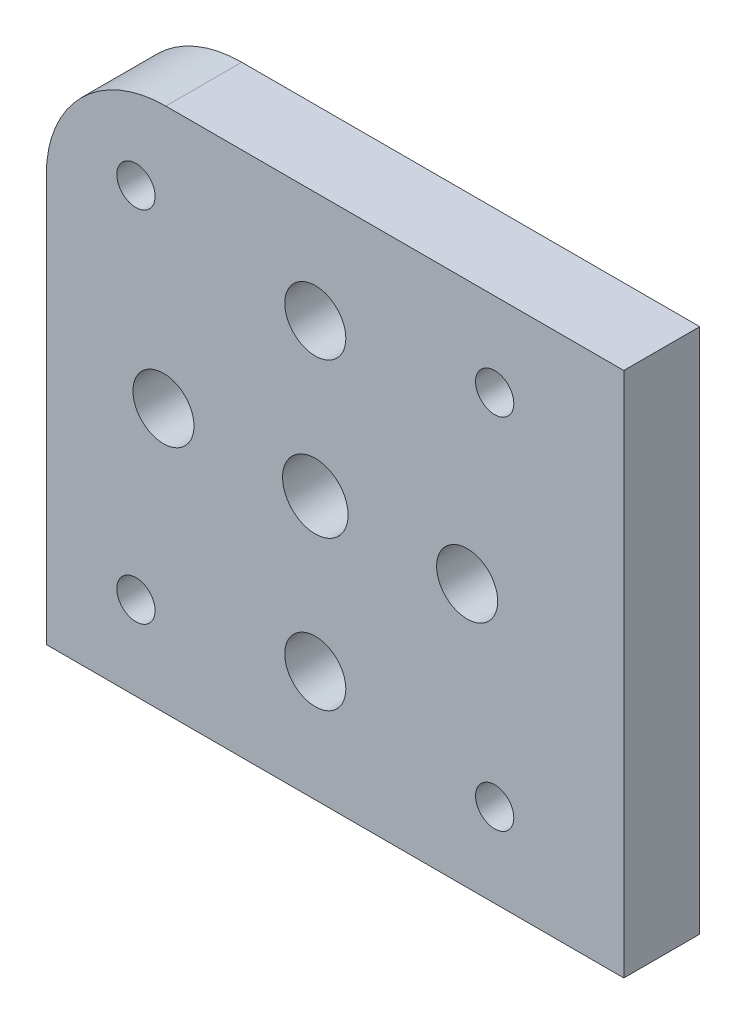
ISO-10303-21;
HEADER;
FILE_DESCRIPTION(('STEP AP214'),'2;1');
FILE_NAME('part.step','',(''),(''),'','','');
FILE_SCHEMA(('AUTOMOTIVE_DESIGN { 1 0 10303 214 1 1 1 1 }'));
ENDSEC;
DATA;
#1=APPLICATION_CONTEXT('core data for automotive mechanical design processes');
#2=APPLICATION_PROTOCOL_DEFINITION('international standard','automotive_design',2000,#1);
#3=PRODUCT_CONTEXT('',#1,'mechanical');
#4=PRODUCT('Part','Part','',(#3));
#5=PRODUCT_RELATED_PRODUCT_CATEGORY('part','',(#4));
#6=PRODUCT_DEFINITION_FORMATION('','',#4);
#7=PRODUCT_DEFINITION_CONTEXT('part definition',#1,'design');
#8=PRODUCT_DEFINITION('design','',#6,#7);
#9=PRODUCT_DEFINITION_SHAPE('','',#8);
#10=(LENGTH_UNIT() NAMED_UNIT(*) SI_UNIT(.MILLI.,.METRE.));
#11=(NAMED_UNIT(*) PLANE_ANGLE_UNIT() SI_UNIT($,.RADIAN.));
#12=(NAMED_UNIT(*) SI_UNIT($,.STERADIAN.) SOLID_ANGLE_UNIT());
#13=UNCERTAINTY_MEASURE_WITH_UNIT(LENGTH_MEASURE(1.E-05),#10,'distance_accuracy_value','');
#14=(GEOMETRIC_REPRESENTATION_CONTEXT(3) GLOBAL_UNCERTAINTY_ASSIGNED_CONTEXT((#13)) GLOBAL_UNIT_ASSIGNED_CONTEXT((#10,
#11,#12)) REPRESENTATION_CONTEXT('',''));
#15=CARTESIAN_POINT('',(0.,0.,0.));
#16=DIRECTION('',(0.,0.,1.));
#17=DIRECTION('',(1.,0.,0.));
#18=AXIS2_PLACEMENT_3D('',#15,#16,#17);
#19=CARTESIAN_POINT('',(48.3,0.,6.35));
#20=DIRECTION('',(1.,0.,0.));
#21=DIRECTION('',(0.,1.,0.));
#22=AXIS2_PLACEMENT_3D('',#19,#20,#21);
#23=PLANE('',#22);
#24=DIRECTION('',(0.,-1.,0.));
#25=VECTOR('',#24,1.);
#26=CARTESIAN_POINT('',(48.3,0.,0.));
#27=LINE('',#26,#25);
#28=CARTESIAN_POINT('',(48.3,0.,0.));
#29=VERTEX_POINT('',#28);
#30=CARTESIAN_POINT('',(48.3,-44.,0.));
#31=VERTEX_POINT('',#30);
#32=EDGE_CURVE('E103',#29,#31,#27,.T.);
#33=ORIENTED_EDGE('',*,*,#32,.F.);
#34=DIRECTION('',(0.,0.,-1.));
#35=VECTOR('',#34,1.);
#36=CARTESIAN_POINT('',(48.3,0.,6.35));
#37=LINE('',#36,#35);
#38=CARTESIAN_POINT('',(48.3,0.,6.35));
#39=VERTEX_POINT('',#38);
#40=EDGE_CURVE('E92',#39,#29,#37,.T.);
#41=ORIENTED_EDGE('',*,*,#40,.F.);
#42=DIRECTION('',(0.,-1.,0.));
#43=VECTOR('',#42,1.);
#44=CARTESIAN_POINT('',(48.3,0.,6.35));
#45=LINE('',#44,#43);
#46=CARTESIAN_POINT('',(48.3,-44.,6.35));
#47=VERTEX_POINT('',#46);
#48=EDGE_CURVE('E98',#39,#47,#45,.T.);
#49=ORIENTED_EDGE('',*,*,#48,.T.);
#50=DIRECTION('',(0.,0.,-1.));
#51=VECTOR('',#50,1.);
#52=CARTESIAN_POINT('',(48.3,-44.,6.35));
#53=LINE('',#52,#51);
#54=EDGE_CURVE('E120',#47,#31,#53,.T.);
#55=ORIENTED_EDGE('',*,*,#54,.T.);
#56=EDGE_LOOP('',(#33,#41,#49,#55));
#57=FACE_BOUND('',#56,.T.);
#58=ADVANCED_FACE('F46',(#57),#23,.T.);
#59=CARTESIAN_POINT('',(0.,0.,6.35));
#60=DIRECTION('',(0.,1.,0.));
#61=DIRECTION('',(0.,0.,1.));
#62=AXIS2_PLACEMENT_3D('',#59,#60,#61);
#63=PLANE('',#62);
#64=DIRECTION('',(1.,0.,0.));
#65=VECTOR('',#64,1.);
#66=CARTESIAN_POINT('',(0.,0.,0.));
#67=LINE('',#66,#65);
#68=CARTESIAN_POINT('',(10.,0.,0.));
#69=VERTEX_POINT('',#68);
#70=EDGE_CURVE('E149',#69,#29,#67,.T.);
#71=ORIENTED_EDGE('',*,*,#70,.F.);
#72=DIRECTION('',(0.,0.,-1.));
#73=VECTOR('',#72,1.);
#74=CARTESIAN_POINT('',(10.,0.,6.35));
#75=LINE('',#74,#73);
#76=CARTESIAN_POINT('',(10.,0.,6.35));
#77=VERTEX_POINT('',#76);
#78=EDGE_CURVE('E54',#69,#77,#75,.F.);
#79=ORIENTED_EDGE('',*,*,#78,.T.);
#80=DIRECTION('',(1.,0.,0.));
#81=VECTOR('',#80,1.);
#82=CARTESIAN_POINT('',(0.,0.,6.35));
#83=LINE('',#82,#81);
#84=EDGE_CURVE('E89',#77,#39,#83,.T.);
#85=ORIENTED_EDGE('',*,*,#84,.T.);
#86=ORIENTED_EDGE('',*,*,#40,.T.);
#87=EDGE_LOOP('',(#71,#79,#85,#86));
#88=FACE_BOUND('',#87,.T.);
#89=ADVANCED_FACE('F91',(#88),#63,.T.);
#90=CARTESIAN_POINT('',(0.,0.,6.35));
#91=DIRECTION('',(1.,0.,0.));
#92=DIRECTION('',(0.,1.,0.));
#93=AXIS2_PLACEMENT_3D('',#90,#91,#92);
#94=PLANE('',#93);
#95=DIRECTION('',(0.,-1.,0.));
#96=VECTOR('',#95,1.);
#97=CARTESIAN_POINT('',(0.,0.,6.35));
#98=LINE('',#97,#96);
#99=CARTESIAN_POINT('',(0.,-10.,6.35));
#100=VERTEX_POINT('',#99);
#101=CARTESIAN_POINT('',(0.,-44.,6.35));
#102=VERTEX_POINT('',#101);
#103=EDGE_CURVE('E97',#100,#102,#98,.T.);
#104=ORIENTED_EDGE('',*,*,#103,.F.);
#105=DIRECTION('',(0.,0.,-1.));
#106=VECTOR('',#105,1.);
#107=CARTESIAN_POINT('',(0.,-10.,0.));
#108=LINE('',#107,#106);
#109=CARTESIAN_POINT('',(0.,-10.,0.));
#110=VERTEX_POINT('',#109);
#111=EDGE_CURVE('E104',#100,#110,#108,.T.);
#112=ORIENTED_EDGE('',*,*,#111,.T.);
#113=DIRECTION('',(0.,-1.,0.));
#114=VECTOR('',#113,1.);
#115=CARTESIAN_POINT('',(0.,0.,0.));
#116=LINE('',#115,#114);
#117=CARTESIAN_POINT('',(0.,-44.,0.));
#118=VERTEX_POINT('',#117);
#119=EDGE_CURVE('E151',#110,#118,#116,.T.);
#120=ORIENTED_EDGE('',*,*,#119,.T.);
#121=DIRECTION('',(0.,0.,-1.));
#122=VECTOR('',#121,1.);
#123=CARTESIAN_POINT('',(0.,-44.,6.35));
#124=LINE('',#123,#122);
#125=EDGE_CURVE('E105',#102,#118,#124,.T.);
#126=ORIENTED_EDGE('',*,*,#125,.F.);
#127=EDGE_LOOP('',(#104,#112,#120,#126));
#128=FACE_BOUND('',#127,.T.);
#129=ADVANCED_FACE('F165',(#128),#94,.F.);
#130=CARTESIAN_POINT('',(7.5,-37.,6.35));
#131=DIRECTION('',(0.,0.,-1.));
#132=DIRECTION('',(-1.,0.,0.));
#133=AXIS2_PLACEMENT_3D('',#130,#131,#132);
#134=CYLINDRICAL_SURFACE('',#133,1.6);
#135=CARTESIAN_POINT('',(7.5,-37.,6.35));
#136=DIRECTION('',(0.,0.,1.));
#137=DIRECTION('',(1.,0.,0.));
#138=AXIS2_PLACEMENT_3D('',#135,#136,#137);
#139=CIRCLE('',#138,1.6);
#140=CARTESIAN_POINT('',(9.1,-37.,6.35));
#141=VERTEX_POINT('',#140);
#142=EDGE_CURVE('E111',#141,#141,#139,.T.);
#143=ORIENTED_EDGE('',*,*,#142,.T.);
#144=EDGE_LOOP('',(#143));
#145=FACE_BOUND('',#144,.T.);
#146=CARTESIAN_POINT('',(7.5,-37.,0.));
#147=DIRECTION('',(0.,0.,1.));
#148=DIRECTION('',(1.,0.,0.));
#149=AXIS2_PLACEMENT_3D('',#146,#147,#148);
#150=CIRCLE('',#149,1.6);
#151=CARTESIAN_POINT('',(9.1,-37.,0.));
#152=VERTEX_POINT('',#151);
#153=EDGE_CURVE('E145',#152,#152,#150,.T.);
#154=ORIENTED_EDGE('',*,*,#153,.F.);
#155=EDGE_LOOP('',(#154));
#156=FACE_BOUND('',#155,.T.);
#157=ADVANCED_FACE('F192',(#145,#156),#134,.F.);
#158=CARTESIAN_POINT('',(22.5,-9.3,6.35));
#159=DIRECTION('',(0.,0.,-1.));
#160=DIRECTION('',(-1.,0.,0.));
#161=AXIS2_PLACEMENT_3D('',#158,#159,#160);
#162=CYLINDRICAL_SURFACE('',#161,2.5527);
#163=CARTESIAN_POINT('',(22.5,-9.3,6.35));
#164=DIRECTION('',(0.,0.,1.));
#165=DIRECTION('',(1.,0.,0.));
#166=AXIS2_PLACEMENT_3D('',#163,#164,#165);
#167=CIRCLE('',#166,2.5527);
#168=CARTESIAN_POINT('',(25.0527,-9.3,6.35));
#169=VERTEX_POINT('',#168);
#170=EDGE_CURVE('E114',#169,#169,#167,.T.);
#171=ORIENTED_EDGE('',*,*,#170,.T.);
#172=EDGE_LOOP('',(#171));
#173=FACE_BOUND('',#172,.T.);
#174=CARTESIAN_POINT('',(22.5,-9.3,0.));
#175=DIRECTION('',(0.,0.,1.));
#176=DIRECTION('',(1.,0.,0.));
#177=AXIS2_PLACEMENT_3D('',#174,#175,#176);
#178=CIRCLE('',#177,2.5527);
#179=CARTESIAN_POINT('',(25.0527,-9.3,0.));
#180=VERTEX_POINT('',#179);
#181=EDGE_CURVE('E142',#180,#180,#178,.T.);
#182=ORIENTED_EDGE('',*,*,#181,.F.);
#183=EDGE_LOOP('',(#182));
#184=FACE_BOUND('',#183,.T.);
#185=ADVANCED_FACE('F195',(#173,#184),#162,.F.);
#186=CARTESIAN_POINT('',(35.2,-22.,6.35));
#187=DIRECTION('',(0.,0.,-1.));
#188=DIRECTION('',(-1.,0.,0.));
#189=AXIS2_PLACEMENT_3D('',#186,#187,#188);
#190=CYLINDRICAL_SURFACE('',#189,2.5527);
#191=CARTESIAN_POINT('',(35.2,-22.,6.35));
#192=DIRECTION('',(0.,0.,1.));
#193=DIRECTION('',(1.,0.,0.));
#194=AXIS2_PLACEMENT_3D('',#191,#192,#193);
#195=CIRCLE('',#194,2.5527);
#196=CARTESIAN_POINT('',(37.7527,-22.,6.35));
#197=VERTEX_POINT('',#196);
#198=EDGE_CURVE('E428',#197,#197,#195,.T.);
#199=ORIENTED_EDGE('',*,*,#198,.T.);
#200=EDGE_LOOP('',(#199));
#201=FACE_BOUND('',#200,.T.);
#202=CARTESIAN_POINT('',(35.2,-22.,0.));
#203=DIRECTION('',(0.,0.,1.));
#204=DIRECTION('',(1.,0.,0.));
#205=AXIS2_PLACEMENT_3D('',#202,#203,#204);
#206=CIRCLE('',#205,2.5527);
#207=CARTESIAN_POINT('',(37.7527,-22.,0.));
#208=VERTEX_POINT('',#207);
#209=EDGE_CURVE('E139',#208,#208,#206,.T.);
#210=ORIENTED_EDGE('',*,*,#209,.F.);
#211=EDGE_LOOP('',(#210));
#212=FACE_BOUND('',#211,.T.);
#213=ADVANCED_FACE('F199',(#201,#212),#190,.F.);
#214=CARTESIAN_POINT('',(9.8,-22.,6.35));
#215=DIRECTION('',(0.,0.,-1.));
#216=DIRECTION('',(-1.,0.,0.));
#217=AXIS2_PLACEMENT_3D('',#214,#215,#216);
#218=CYLINDRICAL_SURFACE('',#217,2.5527);
#219=CARTESIAN_POINT('',(9.8,-22.,6.35));
#220=DIRECTION('',(0.,0.,1.));
#221=DIRECTION('',(1.,0.,0.));
#222=AXIS2_PLACEMENT_3D('',#219,#220,#221);
#223=CIRCLE('',#222,2.5527);
#224=CARTESIAN_POINT('',(12.3527,-22.,6.35));
#225=VERTEX_POINT('',#224);
#226=EDGE_CURVE('E425',#225,#225,#223,.T.);
#227=ORIENTED_EDGE('',*,*,#226,.T.);
#228=EDGE_LOOP('',(#227));
#229=FACE_BOUND('',#228,.T.);
#230=CARTESIAN_POINT('',(9.8,-22.,0.));
#231=DIRECTION('',(0.,0.,1.));
#232=DIRECTION('',(1.,0.,0.));
#233=AXIS2_PLACEMENT_3D('',#230,#231,#232);
#234=CIRCLE('',#233,2.5527);
#235=CARTESIAN_POINT('',(12.3527,-22.,0.));
#236=VERTEX_POINT('',#235);
#237=EDGE_CURVE('E136',#236,#236,#234,.T.);
#238=ORIENTED_EDGE('',*,*,#237,.F.);
#239=EDGE_LOOP('',(#238));
#240=FACE_BOUND('',#239,.T.);
#241=ADVANCED_FACE('F203',(#229,#240),#218,.F.);
#242=CARTESIAN_POINT('',(22.5,-34.7,6.35));
#243=DIRECTION('',(0.,0.,-1.));
#244=DIRECTION('',(-1.,0.,0.));
#245=AXIS2_PLACEMENT_3D('',#242,#243,#244);
#246=CYLINDRICAL_SURFACE('',#245,2.5527);
#247=CARTESIAN_POINT('',(22.5,-34.7,6.35));
#248=DIRECTION('',(0.,0.,1.));
#249=DIRECTION('',(1.,0.,0.));
#250=AXIS2_PLACEMENT_3D('',#247,#248,#249);
#251=CIRCLE('',#250,2.5527);
#252=CARTESIAN_POINT('',(25.0527,-34.7,6.35));
#253=VERTEX_POINT('',#252);
#254=EDGE_CURVE('E422',#253,#253,#251,.T.);
#255=ORIENTED_EDGE('',*,*,#254,.T.);
#256=EDGE_LOOP('',(#255));
#257=FACE_BOUND('',#256,.T.);
#258=CARTESIAN_POINT('',(22.5,-34.7,0.));
#259=DIRECTION('',(0.,0.,1.));
#260=DIRECTION('',(1.,0.,0.));
#261=AXIS2_PLACEMENT_3D('',#258,#259,#260);
#262=CIRCLE('',#261,2.5527);
#263=CARTESIAN_POINT('',(25.0527,-34.7,0.));
#264=VERTEX_POINT('',#263);
#265=EDGE_CURVE('E133',#264,#264,#262,.T.);
#266=ORIENTED_EDGE('',*,*,#265,.F.);
#267=EDGE_LOOP('',(#266));
#268=FACE_BOUND('',#267,.T.);
#269=ADVANCED_FACE('F207',(#257,#268),#246,.F.);
#270=CARTESIAN_POINT('',(37.5,-37.,6.35));
#271=DIRECTION('',(0.,0.,-1.));
#272=DIRECTION('',(-1.,0.,0.));
#273=AXIS2_PLACEMENT_3D('',#270,#271,#272);
#274=CYLINDRICAL_SURFACE('',#273,1.60000000000001);
#275=CARTESIAN_POINT('',(37.5,-37.,6.35));
#276=DIRECTION('',(0.,0.,1.));
#277=DIRECTION('',(1.,0.,0.));
#278=AXIS2_PLACEMENT_3D('',#275,#276,#277);
#279=CIRCLE('',#278,1.60000000000001);
#280=CARTESIAN_POINT('',(39.1,-37.,6.35));
#281=VERTEX_POINT('',#280);
#282=EDGE_CURVE('E415',#281,#281,#279,.T.);
#283=ORIENTED_EDGE('',*,*,#282,.T.);
#284=EDGE_LOOP('',(#283));
#285=FACE_BOUND('',#284,.T.);
#286=CARTESIAN_POINT('',(37.5,-37.,0.));
#287=DIRECTION('',(0.,0.,1.));
#288=DIRECTION('',(1.,0.,0.));
#289=AXIS2_PLACEMENT_3D('',#286,#287,#288);
#290=CIRCLE('',#289,1.60000000000001);
#291=CARTESIAN_POINT('',(39.1,-37.,0.));
#292=VERTEX_POINT('',#291);
#293=EDGE_CURVE('E130',#292,#292,#290,.T.);
#294=ORIENTED_EDGE('',*,*,#293,.F.);
#295=EDGE_LOOP('',(#294));
#296=FACE_BOUND('',#295,.T.);
#297=ADVANCED_FACE('F211',(#285,#296),#274,.F.);
#298=CARTESIAN_POINT('',(37.5,-7.,6.35));
#299=DIRECTION('',(0.,0.,-1.));
#300=DIRECTION('',(-1.,0.,0.));
#301=AXIS2_PLACEMENT_3D('',#298,#299,#300);
#302=CYLINDRICAL_SURFACE('',#301,1.6);
#303=CARTESIAN_POINT('',(37.5,-7.,6.35));
#304=DIRECTION('',(0.,0.,1.));
#305=DIRECTION('',(1.,0.,0.));
#306=AXIS2_PLACEMENT_3D('',#303,#304,#305);
#307=CIRCLE('',#306,1.6);
#308=CARTESIAN_POINT('',(39.1,-7.,6.35));
#309=VERTEX_POINT('',#308);
#310=EDGE_CURVE('E412',#309,#309,#307,.T.);
#311=ORIENTED_EDGE('',*,*,#310,.T.);
#312=EDGE_LOOP('',(#311));
#313=FACE_BOUND('',#312,.T.);
#314=CARTESIAN_POINT('',(37.5,-7.,0.));
#315=DIRECTION('',(0.,0.,1.));
#316=DIRECTION('',(1.,0.,0.));
#317=AXIS2_PLACEMENT_3D('',#314,#315,#316);
#318=CIRCLE('',#317,1.6);
#319=CARTESIAN_POINT('',(39.1,-7.,0.));
#320=VERTEX_POINT('',#319);
#321=EDGE_CURVE('E127',#320,#320,#318,.T.);
#322=ORIENTED_EDGE('',*,*,#321,.F.);
#323=EDGE_LOOP('',(#322));
#324=FACE_BOUND('',#323,.T.);
#325=ADVANCED_FACE('F215',(#313,#324),#302,.F.);
#326=CARTESIAN_POINT('',(7.5,-7.,6.35));
#327=DIRECTION('',(0.,0.,-1.));
#328=DIRECTION('',(-1.,0.,0.));
#329=AXIS2_PLACEMENT_3D('',#326,#327,#328);
#330=CYLINDRICAL_SURFACE('',#329,1.6);
#331=CARTESIAN_POINT('',(7.5,-7.,6.35));
#332=DIRECTION('',(0.,0.,1.));
#333=DIRECTION('',(1.,0.,0.));
#334=AXIS2_PLACEMENT_3D('',#331,#332,#333);
#335=CIRCLE('',#334,1.6);
#336=CARTESIAN_POINT('',(9.1,-7.,6.35));
#337=VERTEX_POINT('',#336);
#338=EDGE_CURVE('E227',#337,#337,#335,.T.);
#339=ORIENTED_EDGE('',*,*,#338,.T.);
#340=EDGE_LOOP('',(#339));
#341=FACE_BOUND('',#340,.T.);
#342=CARTESIAN_POINT('',(7.5,-7.,0.));
#343=DIRECTION('',(0.,0.,1.));
#344=DIRECTION('',(1.,0.,0.));
#345=AXIS2_PLACEMENT_3D('',#342,#343,#344);
#346=CIRCLE('',#345,1.6);
#347=CARTESIAN_POINT('',(9.1,-7.,0.));
#348=VERTEX_POINT('',#347);
#349=EDGE_CURVE('E124',#348,#348,#346,.T.);
#350=ORIENTED_EDGE('',*,*,#349,.F.);
#351=EDGE_LOOP('',(#350));
#352=FACE_BOUND('',#351,.T.);
#353=ADVANCED_FACE('F181',(#341,#352),#330,.F.);
#354=CARTESIAN_POINT('',(22.5,-22.,6.35));
#355=DIRECTION('',(0.,0.,-1.));
#356=DIRECTION('',(-1.,0.,0.));
#357=AXIS2_PLACEMENT_3D('',#354,#355,#356);
#358=CYLINDRICAL_SURFACE('',#357,2.74060404499892);
#359=CARTESIAN_POINT('',(22.5,-22.,6.35));
#360=DIRECTION('',(0.,0.,1.));
#361=DIRECTION('',(1.,0.,0.));
#362=AXIS2_PLACEMENT_3D('',#359,#360,#361);
#363=CIRCLE('',#362,2.74060404499892);
#364=CARTESIAN_POINT('',(25.2406040449989,-22.,6.35));
#365=VERTEX_POINT('',#364);
#366=EDGE_CURVE('E156',#365,#365,#363,.T.);
#367=ORIENTED_EDGE('',*,*,#366,.T.);
#368=EDGE_LOOP('',(#367));
#369=FACE_BOUND('',#368,.T.);
#370=CARTESIAN_POINT('',(22.5,-22.,0.));
#371=DIRECTION('',(0.,0.,1.));
#372=DIRECTION('',(1.,0.,0.));
#373=AXIS2_PLACEMENT_3D('',#370,#371,#372);
#374=CIRCLE('',#373,2.74060404499892);
#375=CARTESIAN_POINT('',(25.2406040449989,-22.,0.));
#376=VERTEX_POINT('',#375);
#377=EDGE_CURVE('E121',#376,#376,#374,.T.);
#378=ORIENTED_EDGE('',*,*,#377,.F.);
#379=EDGE_LOOP('',(#378));
#380=FACE_BOUND('',#379,.T.);
#381=ADVANCED_FACE('F173',(#369,#380),#358,.F.);
#382=CARTESIAN_POINT('',(0.,-44.,6.35));
#383=DIRECTION('',(0.,1.,0.));
#384=DIRECTION('',(0.,0.,1.));
#385=AXIS2_PLACEMENT_3D('',#382,#383,#384);
#386=PLANE('',#385);
#387=DIRECTION('',(1.,0.,0.));
#388=VECTOR('',#387,1.);
#389=CARTESIAN_POINT('',(0.,-44.,0.));
#390=LINE('',#389,#388);
#391=EDGE_CURVE('E153',#118,#31,#390,.T.);
#392=ORIENTED_EDGE('',*,*,#391,.T.);
#393=ORIENTED_EDGE('',*,*,#54,.F.);
#394=DIRECTION('',(1.,0.,0.));
#395=VECTOR('',#394,1.);
#396=CARTESIAN_POINT('',(0.,-44.,6.35));
#397=LINE('',#396,#395);
#398=EDGE_CURVE('E109',#102,#47,#397,.T.);
#399=ORIENTED_EDGE('',*,*,#398,.F.);
#400=ORIENTED_EDGE('',*,*,#125,.T.);
#401=EDGE_LOOP('',(#392,#393,#399,#400));
#402=FACE_BOUND('',#401,.T.);
#403=ADVANCED_FACE('F171',(#402),#386,.F.);
#404=CARTESIAN_POINT('',(0.,0.,6.35));
#405=DIRECTION('',(0.,0.,1.));
#406=DIRECTION('',(1.,0.,0.));
#407=AXIS2_PLACEMENT_3D('',#404,#405,#406);
#408=PLANE('',#407);
#409=ORIENTED_EDGE('',*,*,#366,.F.);
#410=EDGE_LOOP('',(#409));
#411=FACE_BOUND('',#410,.T.);
#412=ORIENTED_EDGE('',*,*,#338,.F.);
#413=EDGE_LOOP('',(#412));
#414=FACE_BOUND('',#413,.T.);
#415=ORIENTED_EDGE('',*,*,#310,.F.);
#416=EDGE_LOOP('',(#415));
#417=FACE_BOUND('',#416,.T.);
#418=ORIENTED_EDGE('',*,*,#282,.F.);
#419=EDGE_LOOP('',(#418));
#420=FACE_BOUND('',#419,.T.);
#421=ORIENTED_EDGE('',*,*,#254,.F.);
#422=EDGE_LOOP('',(#421));
#423=FACE_BOUND('',#422,.T.);
#424=ORIENTED_EDGE('',*,*,#226,.F.);
#425=EDGE_LOOP('',(#424));
#426=FACE_BOUND('',#425,.T.);
#427=ORIENTED_EDGE('',*,*,#198,.F.);
#428=EDGE_LOOP('',(#427));
#429=FACE_BOUND('',#428,.T.);
#430=ORIENTED_EDGE('',*,*,#170,.F.);
#431=EDGE_LOOP('',(#430));
#432=FACE_BOUND('',#431,.T.);
#433=ORIENTED_EDGE('',*,*,#142,.F.);
#434=EDGE_LOOP('',(#433));
#435=FACE_BOUND('',#434,.T.);
#436=ORIENTED_EDGE('',*,*,#84,.F.);
#437=CARTESIAN_POINT('',(10.,-10.,6.35));
#438=DIRECTION('',(0.,0.,1.));
#439=DIRECTION('',(1.,0.,0.));
#440=AXIS2_PLACEMENT_3D('',#437,#438,#439);
#441=CIRCLE('',#440,10.);
#442=EDGE_CURVE('E11',#77,#100,#441,.T.);
#443=ORIENTED_EDGE('',*,*,#442,.T.);
#444=ORIENTED_EDGE('',*,*,#103,.T.);
#445=ORIENTED_EDGE('',*,*,#398,.T.);
#446=ORIENTED_EDGE('',*,*,#48,.F.);
#447=EDGE_LOOP('',(#436,#443,#444,#445,#446));
#448=FACE_BOUND('',#447,.T.);
#449=ADVANCED_FACE('F107',(#411,#414,#417,#420,#423,#426,#429,#432,#435,#448),#408,.T.);
#450=CARTESIAN_POINT('',(0.,0.,0.));
#451=DIRECTION('',(0.,0.,1.));
#452=DIRECTION('',(1.,0.,0.));
#453=AXIS2_PLACEMENT_3D('',#450,#451,#452);
#454=PLANE('',#453);
#455=ORIENTED_EDGE('',*,*,#377,.T.);
#456=EDGE_LOOP('',(#455));
#457=FACE_BOUND('',#456,.T.);
#458=ORIENTED_EDGE('',*,*,#349,.T.);
#459=EDGE_LOOP('',(#458));
#460=FACE_BOUND('',#459,.T.);
#461=ORIENTED_EDGE('',*,*,#321,.T.);
#462=EDGE_LOOP('',(#461));
#463=FACE_BOUND('',#462,.T.);
#464=ORIENTED_EDGE('',*,*,#293,.T.);
#465=EDGE_LOOP('',(#464));
#466=FACE_BOUND('',#465,.T.);
#467=ORIENTED_EDGE('',*,*,#265,.T.);
#468=EDGE_LOOP('',(#467));
#469=FACE_BOUND('',#468,.T.);
#470=ORIENTED_EDGE('',*,*,#237,.T.);
#471=EDGE_LOOP('',(#470));
#472=FACE_BOUND('',#471,.T.);
#473=ORIENTED_EDGE('',*,*,#209,.T.);
#474=EDGE_LOOP('',(#473));
#475=FACE_BOUND('',#474,.T.);
#476=ORIENTED_EDGE('',*,*,#181,.T.);
#477=EDGE_LOOP('',(#476));
#478=FACE_BOUND('',#477,.T.);
#479=ORIENTED_EDGE('',*,*,#153,.T.);
#480=EDGE_LOOP('',(#479));
#481=FACE_BOUND('',#480,.T.);
#482=ORIENTED_EDGE('',*,*,#119,.F.);
#483=CARTESIAN_POINT('',(10.,-10.,0.));
#484=DIRECTION('',(0.,0.,1.));
#485=DIRECTION('',(1.,0.,0.));
#486=AXIS2_PLACEMENT_3D('',#483,#484,#485);
#487=CIRCLE('',#486,10.);
#488=EDGE_CURVE('E68',#110,#69,#487,.F.);
#489=ORIENTED_EDGE('',*,*,#488,.T.);
#490=ORIENTED_EDGE('',*,*,#70,.T.);
#491=ORIENTED_EDGE('',*,*,#32,.T.);
#492=ORIENTED_EDGE('',*,*,#391,.F.);
#493=EDGE_LOOP('',(#482,#489,#490,#491,#492));
#494=FACE_BOUND('',#493,.T.);
#495=ADVANCED_FACE('F169',(#457,#460,#463,#466,#469,#472,#475,#478,#481,#494),#454,.F.);
#496=CARTESIAN_POINT('',(10.,-10.,6.35));
#497=DIRECTION('',(0.,0.,1.));
#498=DIRECTION('',(1.,0.,0.));
#499=AXIS2_PLACEMENT_3D('',#496,#497,#498);
#500=CYLINDRICAL_SURFACE('',#499,10.);
#501=ORIENTED_EDGE('',*,*,#442,.F.);
#502=ORIENTED_EDGE('',*,*,#78,.F.);
#503=ORIENTED_EDGE('',*,*,#488,.F.);
#504=ORIENTED_EDGE('',*,*,#111,.F.);
#505=EDGE_LOOP('',(#501,#502,#503,#504));
#506=FACE_BOUND('',#505,.T.);
#507=ADVANCED_FACE('F48',(#506),#500,.T.);
#508=CLOSED_SHELL('',(#58,#89,#129,#157,#185,#213,#241,#269,#297,#325,#353,#381,#403,#449,#495,#507));
#509=MANIFOLD_SOLID_BREP('B2',#508);
#510=ADVANCED_BREP_SHAPE_REPRESENTATION('',(#18,#509),#14);
#511=SHAPE_DEFINITION_REPRESENTATION(#9,#510);
ENDSEC;
END-ISO-10303-21;
